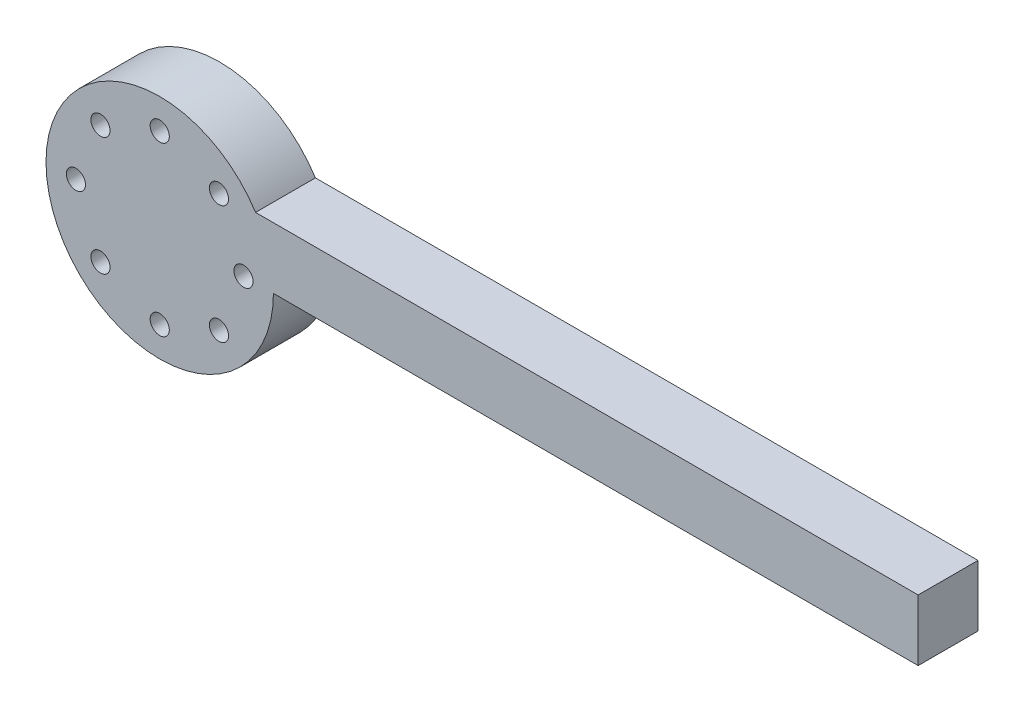
ISO-10303-21;
HEADER;
FILE_DESCRIPTION(('STEP AP214'),'2;1');
FILE_NAME('part.step','',(''),(''),'','','');
FILE_SCHEMA(('AUTOMOTIVE_DESIGN { 1 0 10303 214 1 1 1 1 }'));
ENDSEC;
DATA;
#1=APPLICATION_CONTEXT('core data for automotive mechanical design processes');
#2=APPLICATION_PROTOCOL_DEFINITION('international standard','automotive_design',2000,#1);
#3=PRODUCT_CONTEXT('',#1,'mechanical');
#4=PRODUCT('Part','Part','',(#3));
#5=PRODUCT_RELATED_PRODUCT_CATEGORY('part','',(#4));
#6=PRODUCT_DEFINITION_FORMATION('','',#4);
#7=PRODUCT_DEFINITION_CONTEXT('part definition',#1,'design');
#8=PRODUCT_DEFINITION('design','',#6,#7);
#9=PRODUCT_DEFINITION_SHAPE('','',#8);
#10=(LENGTH_UNIT() NAMED_UNIT(*) SI_UNIT(.MILLI.,.METRE.));
#11=(NAMED_UNIT(*) PLANE_ANGLE_UNIT() SI_UNIT($,.RADIAN.));
#12=(NAMED_UNIT(*) SI_UNIT($,.STERADIAN.) SOLID_ANGLE_UNIT());
#13=UNCERTAINTY_MEASURE_WITH_UNIT(LENGTH_MEASURE(1.E-05),#10,'distance_accuracy_value','');
#14=(GEOMETRIC_REPRESENTATION_CONTEXT(3) GLOBAL_UNCERTAINTY_ASSIGNED_CONTEXT((#13)) GLOBAL_UNIT_ASSIGNED_CONTEXT((#10,
#11,#12)) REPRESENTATION_CONTEXT('',''));
#15=CARTESIAN_POINT('',(0.,0.,0.));
#16=DIRECTION('',(0.,0.,1.));
#17=DIRECTION('',(1.,0.,0.));
#18=AXIS2_PLACEMENT_3D('',#15,#16,#17);
#19=CARTESIAN_POINT('',(0.,0.,5.));
#20=DIRECTION('',(0.,0.,-1.));
#21=DIRECTION('',(-1.,0.,0.));
#22=AXIS2_PLACEMENT_3D('',#19,#20,#21);
#23=CYLINDRICAL_SURFACE('',#22,9.5);
#24=CARTESIAN_POINT('',(0.,0.,5.));
#25=DIRECTION('',(0.,0.,1.));
#26=DIRECTION('',(1.,0.,0.));
#27=AXIS2_PLACEMENT_3D('',#24,#25,#26);
#28=CIRCLE('',#27,9.5);
#29=CARTESIAN_POINT('',(8.00716659536665,5.11226790319565,5.));
#30=VERTEX_POINT('',#29);
#31=CARTESIAN_POINT('',(9.5,0.,5.));
#32=VERTEX_POINT('',#31);
#33=EDGE_CURVE('E11',#30,#32,#28,.T.);
#34=ORIENTED_EDGE('',*,*,#33,.F.);
#35=DIRECTION('',(0.,0.,-1.));
#36=VECTOR('',#35,1.);
#37=CARTESIAN_POINT('',(8.00716659536665,5.11226790319565,60.5911490913365));
#38=LINE('',#37,#36);
#39=CARTESIAN_POINT('',(8.00716659536665,5.11226790319565,0.));
#40=VERTEX_POINT('',#39);
#41=EDGE_CURVE('E91',#30,#40,#38,.T.);
#42=ORIENTED_EDGE('',*,*,#41,.T.);
#43=CARTESIAN_POINT('',(0.,0.,0.));
#44=DIRECTION('',(0.,0.,1.));
#45=DIRECTION('',(1.,0.,0.));
#46=AXIS2_PLACEMENT_3D('',#43,#44,#45);
#47=CIRCLE('',#46,9.5);
#48=CARTESIAN_POINT('',(9.5,0.,0.));
#49=VERTEX_POINT('',#48);
#50=EDGE_CURVE('E36',#40,#49,#47,.T.);
#51=ORIENTED_EDGE('',*,*,#50,.T.);
#52=DIRECTION('',(0.,0.,-1.));
#53=VECTOR('',#52,1.);
#54=CARTESIAN_POINT('',(9.5,0.,60.5911490913365));
#55=LINE('',#54,#53);
#56=EDGE_CURVE('E50',#32,#49,#55,.T.);
#57=ORIENTED_EDGE('',*,*,#56,.F.);
#58=EDGE_LOOP('',(#34,#42,#51,#57));
#59=FACE_BOUND('',#58,.T.);
#60=ADVANCED_FACE('F33',(#59),#23,.T.);
#61=CARTESIAN_POINT('',(0.,0.,5.));
#62=DIRECTION('',(0.,0.,1.));
#63=DIRECTION('',(1.,0.,0.));
#64=AXIS2_PLACEMENT_3D('',#61,#62,#63);
#65=PLANE('',#64);
#66=CARTESIAN_POINT('',(0.,7.,5.));
#67=DIRECTION('',(0.,0.,-1.));
#68=DIRECTION('',(-1.,0.,0.));
#69=AXIS2_PLACEMENT_3D('',#66,#67,#68);
#70=CIRCLE('',#69,0.8);
#71=CARTESIAN_POINT('',(-0.8,7.,5.));
#72=VERTEX_POINT('',#71);
#73=EDGE_CURVE('E108',#72,#72,#70,.T.);
#74=ORIENTED_EDGE('',*,*,#73,.T.);
#75=EDGE_LOOP('',(#74));
#76=FACE_BOUND('',#75,.T.);
#77=CARTESIAN_POINT('',(-4.94974746830584,4.94974746830583,5.));
#78=DIRECTION('',(0.,0.,-1.));
#79=DIRECTION('',(-1.,0.,0.));
#80=AXIS2_PLACEMENT_3D('',#77,#78,#79);
#81=CIRCLE('',#80,0.8);
#82=CARTESIAN_POINT('',(-5.74974746830584,4.94974746830583,5.));
#83=VERTEX_POINT('',#82);
#84=EDGE_CURVE('E149',#83,#83,#81,.T.);
#85=ORIENTED_EDGE('',*,*,#84,.T.);
#86=EDGE_LOOP('',(#85));
#87=FACE_BOUND('',#86,.T.);
#88=CARTESIAN_POINT('',(-7.0000000000002,1.98094713253425E-13,5.));
#89=DIRECTION('',(0.,0.,-1.));
#90=DIRECTION('',(-1.,0.,0.));
#91=AXIS2_PLACEMENT_3D('',#88,#89,#90);
#92=CIRCLE('',#91,0.800000000000155);
#93=CARTESIAN_POINT('',(-7.80000000000035,1.98094713253425E-13,5.));
#94=VERTEX_POINT('',#93);
#95=EDGE_CURVE('E143',#94,#94,#92,.T.);
#96=ORIENTED_EDGE('',*,*,#95,.T.);
#97=EDGE_LOOP('',(#96));
#98=FACE_BOUND('',#97,.T.);
#99=CARTESIAN_POINT('',(-4.94974746830617,-4.94974746830569,5.));
#100=DIRECTION('',(0.,0.,-1.));
#101=DIRECTION('',(-1.,0.,0.));
#102=AXIS2_PLACEMENT_3D('',#99,#100,#101);
#103=CIRCLE('',#102,0.800000000000317);
#104=CARTESIAN_POINT('',(-5.74974746830649,-4.94974746830569,5.));
#105=VERTEX_POINT('',#104);
#106=EDGE_CURVE('E137',#105,#105,#103,.T.);
#107=ORIENTED_EDGE('',*,*,#106,.T.);
#108=EDGE_LOOP('',(#107));
#109=FACE_BOUND('',#108,.T.);
#110=CARTESIAN_POINT('',(-3.9618942650685E-13,-7.,5.));
#111=DIRECTION('',(0.,0.,-1.));
#112=DIRECTION('',(-1.,0.,0.));
#113=AXIS2_PLACEMENT_3D('',#110,#111,#112);
#114=CIRCLE('',#113,0.800000000000426);
#115=CARTESIAN_POINT('',(-0.800000000000822,-7.,5.));
#116=VERTEX_POINT('',#115);
#117=EDGE_CURVE('E131',#116,#116,#114,.T.);
#118=ORIENTED_EDGE('',*,*,#117,.T.);
#119=EDGE_LOOP('',(#118));
#120=FACE_BOUND('',#119,.T.);
#121=CARTESIAN_POINT('',(4.9497474683055,-4.94974746830597,5.));
#122=DIRECTION('',(0.,0.,-1.));
#123=DIRECTION('',(-1.,0.,0.));
#124=AXIS2_PLACEMENT_3D('',#121,#122,#123);
#125=CIRCLE('',#124,0.800000000000425);
#126=CARTESIAN_POINT('',(4.14974746830507,-4.94974746830597,5.));
#127=VERTEX_POINT('',#126);
#128=EDGE_CURVE('E125',#127,#127,#125,.T.);
#129=ORIENTED_EDGE('',*,*,#128,.T.);
#130=EDGE_LOOP('',(#129));
#131=FACE_BOUND('',#130,.T.);
#132=CARTESIAN_POINT('',(6.9999999999998,-1.98951966012828E-13,5.));
#133=DIRECTION('',(0.,0.,-1.));
#134=DIRECTION('',(-1.,0.,0.));
#135=AXIS2_PLACEMENT_3D('',#132,#133,#134);
#136=CIRCLE('',#135,0.800000000000319);
#137=CARTESIAN_POINT('',(6.19999999999948,-1.98951966012828E-13,5.));
#138=VERTEX_POINT('',#137);
#139=EDGE_CURVE('E119',#138,#138,#136,.T.);
#140=ORIENTED_EDGE('',*,*,#139,.T.);
#141=EDGE_LOOP('',(#140));
#142=FACE_BOUND('',#141,.T.);
#143=CARTESIAN_POINT('',(4.94974746830578,4.94974746830569,5.));
#144=DIRECTION('',(0.,0.,-1.));
#145=DIRECTION('',(-1.,0.,0.));
#146=AXIS2_PLACEMENT_3D('',#143,#144,#145);
#147=CIRCLE('',#146,0.800000000000179);
#148=CARTESIAN_POINT('',(4.1497474683056,4.94974746830569,5.));
#149=VERTEX_POINT('',#148);
#150=EDGE_CURVE('E113',#149,#149,#147,.T.);
#151=ORIENTED_EDGE('',*,*,#150,.T.);
#152=EDGE_LOOP('',(#151));
#153=FACE_BOUND('',#152,.T.);
#154=ORIENTED_EDGE('',*,*,#33,.T.);
#155=DIRECTION('',(-1.,0.,0.));
#156=VECTOR('',#155,1.);
#157=CARTESIAN_POINT('',(63.3627496397277,0.,5.));
#158=LINE('',#157,#156);
#159=CARTESIAN_POINT('',(63.3627496397277,0.,5.));
#160=VERTEX_POINT('',#159);
#161=EDGE_CURVE('E76',#160,#32,#158,.T.);
#162=ORIENTED_EDGE('',*,*,#161,.F.);
#163=DIRECTION('',(0.,-1.,0.));
#164=VECTOR('',#163,1.);
#165=CARTESIAN_POINT('',(63.3627496397277,5.11226790319565,5.));
#166=LINE('',#165,#164);
#167=CARTESIAN_POINT('',(63.3627496397277,5.11226790319565,5.));
#168=VERTEX_POINT('',#167);
#169=EDGE_CURVE('E69',#168,#160,#166,.T.);
#170=ORIENTED_EDGE('',*,*,#169,.F.);
#171=DIRECTION('',(1.,0.,0.));
#172=VECTOR('',#171,1.);
#173=CARTESIAN_POINT('',(8.00716659536665,5.11226790319565,5.));
#174=LINE('',#173,#172);
#175=EDGE_CURVE('E73',#30,#168,#174,.T.);
#176=ORIENTED_EDGE('',*,*,#175,.F.);
#177=EDGE_LOOP('',(#154,#162,#170,#176));
#178=FACE_BOUND('',#177,.T.);
#179=ADVANCED_FACE('F71',(#76,#87,#98,#109,#120,#131,#142,#153,#178),#65,.T.);
#180=CARTESIAN_POINT('',(0.,0.,0.));
#181=DIRECTION('',(0.,0.,1.));
#182=DIRECTION('',(1.,0.,0.));
#183=AXIS2_PLACEMENT_3D('',#180,#181,#182);
#184=PLANE('',#183);
#185=CARTESIAN_POINT('',(0.,7.,0.));
#186=DIRECTION('',(0.,0.,-1.));
#187=DIRECTION('',(-1.,0.,0.));
#188=AXIS2_PLACEMENT_3D('',#185,#186,#187);
#189=CIRCLE('',#188,0.8);
#190=CARTESIAN_POINT('',(-0.8,7.,0.));
#191=VERTEX_POINT('',#190);
#192=EDGE_CURVE('E152',#191,#191,#189,.T.);
#193=ORIENTED_EDGE('',*,*,#192,.F.);
#194=EDGE_LOOP('',(#193));
#195=FACE_BOUND('',#194,.T.);
#196=CARTESIAN_POINT('',(-4.94974746830584,4.94974746830583,0.));
#197=DIRECTION('',(0.,0.,-1.));
#198=DIRECTION('',(-1.,0.,0.));
#199=AXIS2_PLACEMENT_3D('',#196,#197,#198);
#200=CIRCLE('',#199,0.8);
#201=CARTESIAN_POINT('',(-5.74974746830584,4.94974746830583,0.));
#202=VERTEX_POINT('',#201);
#203=EDGE_CURVE('E146',#202,#202,#200,.T.);
#204=ORIENTED_EDGE('',*,*,#203,.F.);
#205=EDGE_LOOP('',(#204));
#206=FACE_BOUND('',#205,.T.);
#207=CARTESIAN_POINT('',(-7.0000000000002,1.98094713253425E-13,0.));
#208=DIRECTION('',(0.,0.,-1.));
#209=DIRECTION('',(-1.,0.,0.));
#210=AXIS2_PLACEMENT_3D('',#207,#208,#209);
#211=CIRCLE('',#210,0.800000000000155);
#212=CARTESIAN_POINT('',(-7.80000000000035,1.98094713253425E-13,0.));
#213=VERTEX_POINT('',#212);
#214=EDGE_CURVE('E140',#213,#213,#211,.T.);
#215=ORIENTED_EDGE('',*,*,#214,.F.);
#216=EDGE_LOOP('',(#215));
#217=FACE_BOUND('',#216,.T.);
#218=CARTESIAN_POINT('',(-4.94974746830617,-4.94974746830569,0.));
#219=DIRECTION('',(0.,0.,-1.));
#220=DIRECTION('',(-1.,0.,0.));
#221=AXIS2_PLACEMENT_3D('',#218,#219,#220);
#222=CIRCLE('',#221,0.800000000000317);
#223=CARTESIAN_POINT('',(-5.74974746830649,-4.94974746830569,0.));
#224=VERTEX_POINT('',#223);
#225=EDGE_CURVE('E134',#224,#224,#222,.T.);
#226=ORIENTED_EDGE('',*,*,#225,.F.);
#227=EDGE_LOOP('',(#226));
#228=FACE_BOUND('',#227,.T.);
#229=CARTESIAN_POINT('',(-3.9618942650685E-13,-7.,0.));
#230=DIRECTION('',(0.,0.,-1.));
#231=DIRECTION('',(-1.,0.,0.));
#232=AXIS2_PLACEMENT_3D('',#229,#230,#231);
#233=CIRCLE('',#232,0.800000000000426);
#234=CARTESIAN_POINT('',(-0.800000000000822,-7.,0.));
#235=VERTEX_POINT('',#234);
#236=EDGE_CURVE('E128',#235,#235,#233,.T.);
#237=ORIENTED_EDGE('',*,*,#236,.F.);
#238=EDGE_LOOP('',(#237));
#239=FACE_BOUND('',#238,.T.);
#240=CARTESIAN_POINT('',(4.9497474683055,-4.94974746830597,0.));
#241=DIRECTION('',(0.,0.,-1.));
#242=DIRECTION('',(-1.,0.,0.));
#243=AXIS2_PLACEMENT_3D('',#240,#241,#242);
#244=CIRCLE('',#243,0.800000000000425);
#245=CARTESIAN_POINT('',(4.14974746830507,-4.94974746830597,0.));
#246=VERTEX_POINT('',#245);
#247=EDGE_CURVE('E122',#246,#246,#244,.T.);
#248=ORIENTED_EDGE('',*,*,#247,.F.);
#249=EDGE_LOOP('',(#248));
#250=FACE_BOUND('',#249,.T.);
#251=CARTESIAN_POINT('',(6.9999999999998,-1.98951966012828E-13,0.));
#252=DIRECTION('',(0.,0.,-1.));
#253=DIRECTION('',(-1.,0.,0.));
#254=AXIS2_PLACEMENT_3D('',#251,#252,#253);
#255=CIRCLE('',#254,0.800000000000319);
#256=CARTESIAN_POINT('',(6.19999999999948,-1.98951966012828E-13,0.));
#257=VERTEX_POINT('',#256);
#258=EDGE_CURVE('E116',#257,#257,#255,.T.);
#259=ORIENTED_EDGE('',*,*,#258,.F.);
#260=EDGE_LOOP('',(#259));
#261=FACE_BOUND('',#260,.T.);
#262=CARTESIAN_POINT('',(4.94974746830578,4.94974746830569,0.));
#263=DIRECTION('',(0.,0.,-1.));
#264=DIRECTION('',(-1.,0.,0.));
#265=AXIS2_PLACEMENT_3D('',#262,#263,#264);
#266=CIRCLE('',#265,0.800000000000179);
#267=CARTESIAN_POINT('',(4.1497474683056,4.94974746830569,0.));
#268=VERTEX_POINT('',#267);
#269=EDGE_CURVE('E110',#268,#268,#266,.T.);
#270=ORIENTED_EDGE('',*,*,#269,.F.);
#271=EDGE_LOOP('',(#270));
#272=FACE_BOUND('',#271,.T.);
#273=ORIENTED_EDGE('',*,*,#50,.F.);
#274=DIRECTION('',(1.,0.,0.));
#275=VECTOR('',#274,1.);
#276=CARTESIAN_POINT('',(8.00716659536665,5.11226790319565,0.));
#277=LINE('',#276,#275);
#278=CARTESIAN_POINT('',(63.3627496397277,5.11226790319565,0.));
#279=VERTEX_POINT('',#278);
#280=EDGE_CURVE('E98',#40,#279,#277,.T.);
#281=ORIENTED_EDGE('',*,*,#280,.T.);
#282=DIRECTION('',(0.,-1.,0.));
#283=VECTOR('',#282,1.);
#284=CARTESIAN_POINT('',(63.3627496397277,5.11226790319565,0.));
#285=LINE('',#284,#283);
#286=CARTESIAN_POINT('',(63.3627496397277,0.,0.));
#287=VERTEX_POINT('',#286);
#288=EDGE_CURVE('E85',#279,#287,#285,.T.);
#289=ORIENTED_EDGE('',*,*,#288,.T.);
#290=DIRECTION('',(-1.,0.,0.));
#291=VECTOR('',#290,1.);
#292=CARTESIAN_POINT('',(63.3627496397277,0.,0.));
#293=LINE('',#292,#291);
#294=EDGE_CURVE('E92',#287,#49,#293,.T.);
#295=ORIENTED_EDGE('',*,*,#294,.T.);
#296=EDGE_LOOP('',(#273,#281,#289,#295));
#297=FACE_BOUND('',#296,.T.);
#298=ADVANCED_FACE('F107',(#195,#206,#217,#228,#239,#250,#261,#272,#297),#184,.F.);
#299=CARTESIAN_POINT('',(8.00716659536665,5.11226790319565,60.5911490913365));
#300=DIRECTION('',(0.,1.,0.));
#301=DIRECTION('',(0.,0.,1.));
#302=AXIS2_PLACEMENT_3D('',#299,#300,#301);
#303=PLANE('',#302);
#304=ORIENTED_EDGE('',*,*,#41,.F.);
#305=ORIENTED_EDGE('',*,*,#175,.T.);
#306=DIRECTION('',(0.,0.,-1.));
#307=VECTOR('',#306,1.);
#308=CARTESIAN_POINT('',(63.3627496397277,5.11226790319565,60.5911490913365));
#309=LINE('',#308,#307);
#310=EDGE_CURVE('E80',#168,#279,#309,.T.);
#311=ORIENTED_EDGE('',*,*,#310,.T.);
#312=ORIENTED_EDGE('',*,*,#280,.F.);
#313=EDGE_LOOP('',(#304,#305,#311,#312));
#314=FACE_BOUND('',#313,.T.);
#315=ADVANCED_FACE('F90',(#314),#303,.T.);
#316=CARTESIAN_POINT('',(63.3627496397277,5.11226790319565,60.5911490913365));
#317=DIRECTION('',(1.,0.,0.));
#318=DIRECTION('',(0.,0.,-1.));
#319=AXIS2_PLACEMENT_3D('',#316,#317,#318);
#320=PLANE('',#319);
#321=ORIENTED_EDGE('',*,*,#310,.F.);
#322=ORIENTED_EDGE('',*,*,#169,.T.);
#323=DIRECTION('',(0.,0.,-1.));
#324=VECTOR('',#323,1.);
#325=CARTESIAN_POINT('',(63.3627496397277,0.,60.5911490913365));
#326=LINE('',#325,#324);
#327=EDGE_CURVE('E79',#160,#287,#326,.T.);
#328=ORIENTED_EDGE('',*,*,#327,.T.);
#329=ORIENTED_EDGE('',*,*,#288,.F.);
#330=EDGE_LOOP('',(#321,#322,#328,#329));
#331=FACE_BOUND('',#330,.T.);
#332=ADVANCED_FACE('F83',(#331),#320,.T.);
#333=CARTESIAN_POINT('',(63.3627496397277,0.,60.5911490913365));
#334=DIRECTION('',(0.,-1.,0.));
#335=DIRECTION('',(0.,0.,-1.));
#336=AXIS2_PLACEMENT_3D('',#333,#334,#335);
#337=PLANE('',#336);
#338=ORIENTED_EDGE('',*,*,#327,.F.);
#339=ORIENTED_EDGE('',*,*,#161,.T.);
#340=ORIENTED_EDGE('',*,*,#56,.T.);
#341=ORIENTED_EDGE('',*,*,#294,.F.);
#342=EDGE_LOOP('',(#338,#339,#340,#341));
#343=FACE_BOUND('',#342,.T.);
#344=ADVANCED_FACE('F106',(#343),#337,.T.);
#345=CARTESIAN_POINT('',(4.94974746830578,4.94974746830569,5.));
#346=DIRECTION('',(0.,0.,-1.));
#347=DIRECTION('',(-1.,0.,0.));
#348=AXIS2_PLACEMENT_3D('',#345,#346,#347);
#349=CYLINDRICAL_SURFACE('',#348,0.800000000000179);
#350=ORIENTED_EDGE('',*,*,#150,.F.);
#351=EDGE_LOOP('',(#350));
#352=FACE_BOUND('',#351,.T.);
#353=ORIENTED_EDGE('',*,*,#269,.T.);
#354=EDGE_LOOP('',(#353));
#355=FACE_BOUND('',#354,.T.);
#356=ADVANCED_FACE('F183',(#352,#355),#349,.F.);
#357=CARTESIAN_POINT('',(6.9999999999998,-1.98951966012828E-13,5.));
#358=DIRECTION('',(0.,0.,-1.));
#359=DIRECTION('',(-1.,0.,0.));
#360=AXIS2_PLACEMENT_3D('',#357,#358,#359);
#361=CYLINDRICAL_SURFACE('',#360,0.800000000000319);
#362=ORIENTED_EDGE('',*,*,#139,.F.);
#363=EDGE_LOOP('',(#362));
#364=FACE_BOUND('',#363,.T.);
#365=ORIENTED_EDGE('',*,*,#258,.T.);
#366=EDGE_LOOP('',(#365));
#367=FACE_BOUND('',#366,.T.);
#368=ADVANCED_FACE('F185',(#364,#367),#361,.F.);
#369=CARTESIAN_POINT('',(4.9497474683055,-4.94974746830597,5.));
#370=DIRECTION('',(0.,0.,-1.));
#371=DIRECTION('',(-1.,0.,0.));
#372=AXIS2_PLACEMENT_3D('',#369,#370,#371);
#373=CYLINDRICAL_SURFACE('',#372,0.800000000000425);
#374=ORIENTED_EDGE('',*,*,#128,.F.);
#375=EDGE_LOOP('',(#374));
#376=FACE_BOUND('',#375,.T.);
#377=ORIENTED_EDGE('',*,*,#247,.T.);
#378=EDGE_LOOP('',(#377));
#379=FACE_BOUND('',#378,.T.);
#380=ADVANCED_FACE('F192',(#376,#379),#373,.F.);
#381=CARTESIAN_POINT('',(-3.9618942650685E-13,-7.,5.));
#382=DIRECTION('',(0.,0.,-1.));
#383=DIRECTION('',(-1.,0.,0.));
#384=AXIS2_PLACEMENT_3D('',#381,#382,#383);
#385=CYLINDRICAL_SURFACE('',#384,0.800000000000426);
#386=ORIENTED_EDGE('',*,*,#117,.F.);
#387=EDGE_LOOP('',(#386));
#388=FACE_BOUND('',#387,.T.);
#389=ORIENTED_EDGE('',*,*,#236,.T.);
#390=EDGE_LOOP('',(#389));
#391=FACE_BOUND('',#390,.T.);
#392=ADVANCED_FACE('F239',(#388,#391),#385,.F.);
#393=CARTESIAN_POINT('',(-4.94974746830617,-4.94974746830569,5.));
#394=DIRECTION('',(0.,0.,-1.));
#395=DIRECTION('',(-1.,0.,0.));
#396=AXIS2_PLACEMENT_3D('',#393,#394,#395);
#397=CYLINDRICAL_SURFACE('',#396,0.800000000000317);
#398=ORIENTED_EDGE('',*,*,#106,.F.);
#399=EDGE_LOOP('',(#398));
#400=FACE_BOUND('',#399,.T.);
#401=ORIENTED_EDGE('',*,*,#225,.T.);
#402=EDGE_LOOP('',(#401));
#403=FACE_BOUND('',#402,.T.);
#404=ADVANCED_FACE('F248',(#400,#403),#397,.F.);
#405=CARTESIAN_POINT('',(-7.0000000000002,1.98094713253425E-13,5.));
#406=DIRECTION('',(0.,0.,-1.));
#407=DIRECTION('',(-1.,0.,0.));
#408=AXIS2_PLACEMENT_3D('',#405,#406,#407);
#409=CYLINDRICAL_SURFACE('',#408,0.800000000000155);
#410=ORIENTED_EDGE('',*,*,#95,.F.);
#411=EDGE_LOOP('',(#410));
#412=FACE_BOUND('',#411,.T.);
#413=ORIENTED_EDGE('',*,*,#214,.T.);
#414=EDGE_LOOP('',(#413));
#415=FACE_BOUND('',#414,.T.);
#416=ADVANCED_FACE('F257',(#412,#415),#409,.F.);
#417=CARTESIAN_POINT('',(-4.94974746830584,4.94974746830583,5.));
#418=DIRECTION('',(0.,0.,-1.));
#419=DIRECTION('',(-1.,0.,0.));
#420=AXIS2_PLACEMENT_3D('',#417,#418,#419);
#421=CYLINDRICAL_SURFACE('',#420,0.8);
#422=ORIENTED_EDGE('',*,*,#84,.F.);
#423=EDGE_LOOP('',(#422));
#424=FACE_BOUND('',#423,.T.);
#425=ORIENTED_EDGE('',*,*,#203,.T.);
#426=EDGE_LOOP('',(#425));
#427=FACE_BOUND('',#426,.T.);
#428=ADVANCED_FACE('F163',(#424,#427),#421,.F.);
#429=CARTESIAN_POINT('',(0.,7.,5.));
#430=DIRECTION('',(0.,0.,-1.));
#431=DIRECTION('',(-1.,0.,0.));
#432=AXIS2_PLACEMENT_3D('',#429,#430,#431);
#433=CYLINDRICAL_SURFACE('',#432,0.8);
#434=ORIENTED_EDGE('',*,*,#73,.F.);
#435=EDGE_LOOP('',(#434));
#436=FACE_BOUND('',#435,.T.);
#437=ORIENTED_EDGE('',*,*,#192,.T.);
#438=EDGE_LOOP('',(#437));
#439=FACE_BOUND('',#438,.T.);
#440=ADVANCED_FACE('F160',(#436,#439),#433,.F.);
#441=CLOSED_SHELL('',(#60,#179,#298,#315,#332,#344,#356,#368,#380,#392,#404,#416,#428,#440));
#442=MANIFOLD_SOLID_BREP('B2',#441);
#443=ADVANCED_BREP_SHAPE_REPRESENTATION('',(#18,#442),#14);
#444=SHAPE_DEFINITION_REPRESENTATION(#9,#443);
ENDSEC;
END-ISO-10303-21;
